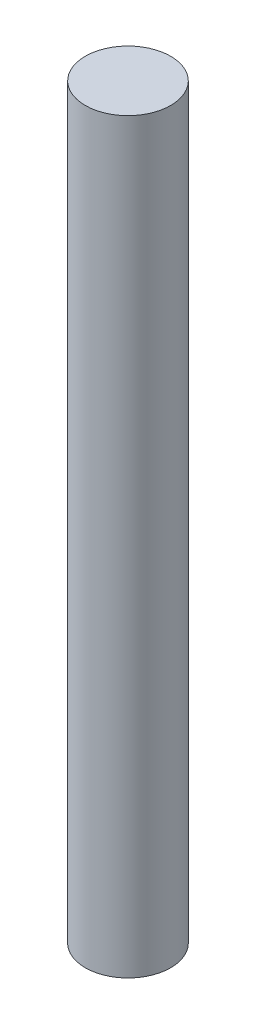
ISO-10303-21;
HEADER;
FILE_DESCRIPTION(('STEP AP214'),'2;1');
FILE_NAME('part.step','',(''),(''),'','','');
FILE_SCHEMA(('AUTOMOTIVE_DESIGN { 1 0 10303 214 1 1 1 1 }'));
ENDSEC;
DATA;
#1=APPLICATION_CONTEXT('core data for automotive mechanical design processes');
#2=APPLICATION_PROTOCOL_DEFINITION('international standard','automotive_design',2000,#1);
#3=PRODUCT_CONTEXT('',#1,'mechanical');
#4=PRODUCT('Part','Part','',(#3));
#5=PRODUCT_RELATED_PRODUCT_CATEGORY('part','',(#4));
#6=PRODUCT_DEFINITION_FORMATION('','',#4);
#7=PRODUCT_DEFINITION_CONTEXT('part definition',#1,'design');
#8=PRODUCT_DEFINITION('design','',#6,#7);
#9=PRODUCT_DEFINITION_SHAPE('','',#8);
#10=(LENGTH_UNIT() NAMED_UNIT(*) SI_UNIT(.MILLI.,.METRE.));
#11=(NAMED_UNIT(*) PLANE_ANGLE_UNIT() SI_UNIT($,.RADIAN.));
#12=(NAMED_UNIT(*) SI_UNIT($,.STERADIAN.) SOLID_ANGLE_UNIT());
#13=UNCERTAINTY_MEASURE_WITH_UNIT(LENGTH_MEASURE(1.E-05),#10,'distance_accuracy_value','');
#14=(GEOMETRIC_REPRESENTATION_CONTEXT(3) GLOBAL_UNCERTAINTY_ASSIGNED_CONTEXT((#13)) GLOBAL_UNIT_ASSIGNED_CONTEXT((#10,
#11,#12)) REPRESENTATION_CONTEXT('',''));
#15=CARTESIAN_POINT('',(0.,0.,0.));
#16=DIRECTION('',(0.,0.,1.));
#17=DIRECTION('',(1.,0.,0.));
#18=AXIS2_PLACEMENT_3D('',#15,#16,#17);
#19=CARTESIAN_POINT('',(0.,35.,0.));
#20=DIRECTION('',(0.,-1.,0.));
#21=DIRECTION('',(0.,0.,-1.));
#22=AXIS2_PLACEMENT_3D('',#19,#20,#21);
#23=CYLINDRICAL_SURFACE('',#22,2.);
#24=CARTESIAN_POINT('',(0.,35.,0.));
#25=DIRECTION('',(0.,1.,0.));
#26=DIRECTION('',(0.,0.,1.));
#27=AXIS2_PLACEMENT_3D('',#24,#25,#26);
#28=CIRCLE('',#27,2.);
#29=CARTESIAN_POINT('',(0.,35.,2.));
#30=VERTEX_POINT('',#29);
#31=EDGE_CURVE('E10',#30,#30,#28,.T.);
#32=ORIENTED_EDGE('',*,*,#31,.F.);
#33=EDGE_LOOP('',(#32));
#34=FACE_BOUND('',#33,.T.);
#35=CARTESIAN_POINT('',(0.,0.,0.));
#36=DIRECTION('',(0.,1.,0.));
#37=DIRECTION('',(0.,0.,1.));
#38=AXIS2_PLACEMENT_3D('',#35,#36,#37);
#39=CIRCLE('',#38,2.);
#40=CARTESIAN_POINT('',(0.,0.,2.));
#41=VERTEX_POINT('',#40);
#42=EDGE_CURVE('E34',#41,#41,#39,.T.);
#43=ORIENTED_EDGE('',*,*,#42,.T.);
#44=EDGE_LOOP('',(#43));
#45=FACE_BOUND('',#44,.T.);
#46=ADVANCED_FACE('F31',(#34,#45),#23,.T.);
#47=CARTESIAN_POINT('',(0.,35.,0.));
#48=DIRECTION('',(0.,1.,0.));
#49=DIRECTION('',(0.,0.,1.));
#50=AXIS2_PLACEMENT_3D('',#47,#48,#49);
#51=PLANE('',#50);
#52=ORIENTED_EDGE('',*,*,#31,.T.);
#53=EDGE_LOOP('',(#52));
#54=FACE_BOUND('',#53,.T.);
#55=ADVANCED_FACE('F46',(#54),#51,.T.);
#56=CARTESIAN_POINT('',(0.,0.,0.));
#57=DIRECTION('',(0.,1.,0.));
#58=DIRECTION('',(0.,0.,1.));
#59=AXIS2_PLACEMENT_3D('',#56,#57,#58);
#60=PLANE('',#59);
#61=ORIENTED_EDGE('',*,*,#42,.F.);
#62=EDGE_LOOP('',(#61));
#63=FACE_BOUND('',#62,.T.);
#64=ADVANCED_FACE('F44',(#63),#60,.F.);
#65=CLOSED_SHELL('',(#46,#55,#64));
#66=MANIFOLD_SOLID_BREP('B2',#65);
#67=ADVANCED_BREP_SHAPE_REPRESENTATION('',(#18,#66),#14);
#68=SHAPE_DEFINITION_REPRESENTATION(#9,#67);
ENDSEC;
END-ISO-10303-21;
